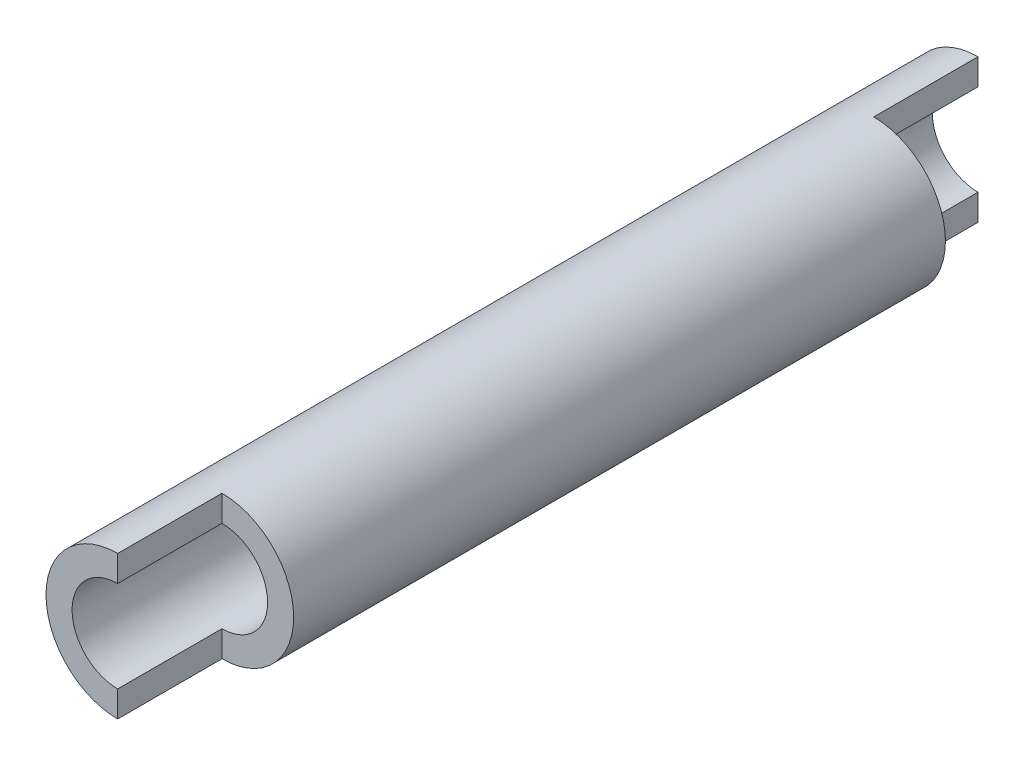
ISO-10303-21;
HEADER;
FILE_DESCRIPTION(('STEP AP214'),'2;1');
FILE_NAME('part.step','',(''),(''),'','','');
FILE_SCHEMA(('AUTOMOTIVE_DESIGN { 1 0 10303 214 1 1 1 1 }'));
ENDSEC;
DATA;
#1=APPLICATION_CONTEXT('core data for automotive mechanical design processes');
#2=APPLICATION_PROTOCOL_DEFINITION('international standard','automotive_design',2000,#1);
#3=PRODUCT_CONTEXT('',#1,'mechanical');
#4=PRODUCT('Part','Part','',(#3));
#5=PRODUCT_RELATED_PRODUCT_CATEGORY('part','',(#4));
#6=PRODUCT_DEFINITION_FORMATION('','',#4);
#7=PRODUCT_DEFINITION_CONTEXT('part definition',#1,'design');
#8=PRODUCT_DEFINITION('design','',#6,#7);
#9=PRODUCT_DEFINITION_SHAPE('','',#8);
#10=(LENGTH_UNIT() NAMED_UNIT(*) SI_UNIT(.MILLI.,.METRE.));
#11=(NAMED_UNIT(*) PLANE_ANGLE_UNIT() SI_UNIT($,.RADIAN.));
#12=(NAMED_UNIT(*) SI_UNIT($,.STERADIAN.) SOLID_ANGLE_UNIT());
#13=UNCERTAINTY_MEASURE_WITH_UNIT(LENGTH_MEASURE(1.E-05),#10,'distance_accuracy_value','');
#14=(GEOMETRIC_REPRESENTATION_CONTEXT(3) GLOBAL_UNCERTAINTY_ASSIGNED_CONTEXT((#13)) GLOBAL_UNIT_ASSIGNED_CONTEXT((#10,
#11,#12)) REPRESENTATION_CONTEXT('',''));
#15=CARTESIAN_POINT('',(0.,0.,0.));
#16=DIRECTION('',(0.,0.,1.));
#17=DIRECTION('',(1.,0.,0.));
#18=AXIS2_PLACEMENT_3D('',#15,#16,#17);
#19=CARTESIAN_POINT('',(0.,0.,50.));
#20=DIRECTION('',(0.,0.,1.));
#21=DIRECTION('',(1.,0.,0.));
#22=AXIS2_PLACEMENT_3D('',#19,#20,#21);
#23=PLANE('',#22);
#24=DIRECTION('',(0.,1.,0.));
#25=VECTOR('',#24,1.);
#26=CARTESIAN_POINT('',(0.,0.,50.));
#27=LINE('',#26,#25);
#28=CARTESIAN_POINT('',(0.,-5.5,50.));
#29=VERTEX_POINT('',#28);
#30=CARTESIAN_POINT('',(0.,-3.5,50.));
#31=VERTEX_POINT('',#30);
#32=EDGE_CURVE('E155',#29,#31,#27,.T.);
#33=ORIENTED_EDGE('',*,*,#32,.F.);
#34=CARTESIAN_POINT('',(0.,0.,50.));
#35=DIRECTION('',(0.,0.,1.));
#36=DIRECTION('',(1.,0.,0.));
#37=AXIS2_PLACEMENT_3D('',#34,#35,#36);
#38=CIRCLE('',#37,5.5);
#39=CARTESIAN_POINT('',(0.,5.5,50.));
#40=VERTEX_POINT('',#39);
#41=EDGE_CURVE('E12',#29,#40,#38,.T.);
#42=ORIENTED_EDGE('',*,*,#41,.T.);
#43=DIRECTION('',(0.,1.,0.));
#44=VECTOR('',#43,1.);
#45=CARTESIAN_POINT('',(0.,0.,50.));
#46=LINE('',#45,#44);
#47=CARTESIAN_POINT('',(0.,3.5,50.));
#48=VERTEX_POINT('',#47);
#49=EDGE_CURVE('E151',#48,#40,#46,.T.);
#50=ORIENTED_EDGE('',*,*,#49,.F.);
#51=CARTESIAN_POINT('',(0.,0.,50.));
#52=DIRECTION('',(0.,0.,1.));
#53=DIRECTION('',(1.,0.,0.));
#54=AXIS2_PLACEMENT_3D('',#51,#52,#53);
#55=CIRCLE('',#54,3.5);
#56=EDGE_CURVE('E158',#31,#48,#55,.T.);
#57=ORIENTED_EDGE('',*,*,#56,.F.);
#58=EDGE_LOOP('',(#33,#42,#50,#57));
#59=FACE_BOUND('',#58,.T.);
#60=ADVANCED_FACE('F37',(#59),#23,.T.);
#61=CARTESIAN_POINT('',(0.,0.,0.));
#62=DIRECTION('',(0.,0.,1.));
#63=DIRECTION('',(1.,0.,0.));
#64=AXIS2_PLACEMENT_3D('',#61,#62,#63);
#65=PLANE('',#64);
#66=CARTESIAN_POINT('',(0.,0.,0.));
#67=DIRECTION('',(0.,0.,1.));
#68=DIRECTION('',(1.,0.,0.));
#69=AXIS2_PLACEMENT_3D('',#66,#67,#68);
#70=CIRCLE('',#69,5.5);
#71=CARTESIAN_POINT('',(0.,-5.5,0.));
#72=VERTEX_POINT('',#71);
#73=CARTESIAN_POINT('',(0.,5.5,0.));
#74=VERTEX_POINT('',#73);
#75=EDGE_CURVE('E41',#72,#74,#70,.T.);
#76=ORIENTED_EDGE('',*,*,#75,.F.);
#77=DIRECTION('',(0.,1.,0.));
#78=VECTOR('',#77,1.);
#79=CARTESIAN_POINT('',(0.,0.,0.));
#80=LINE('',#79,#78);
#81=CARTESIAN_POINT('',(0.,-3.5,0.));
#82=VERTEX_POINT('',#81);
#83=EDGE_CURVE('E153',#72,#82,#80,.T.);
#84=ORIENTED_EDGE('',*,*,#83,.T.);
#85=CARTESIAN_POINT('',(0.,0.,0.));
#86=DIRECTION('',(0.,0.,1.));
#87=DIRECTION('',(1.,0.,0.));
#88=AXIS2_PLACEMENT_3D('',#85,#86,#87);
#89=CIRCLE('',#88,3.5);
#90=CARTESIAN_POINT('',(0.,3.5,0.));
#91=VERTEX_POINT('',#90);
#92=EDGE_CURVE('E107',#82,#91,#89,.T.);
#93=ORIENTED_EDGE('',*,*,#92,.T.);
#94=DIRECTION('',(0.,1.,0.));
#95=VECTOR('',#94,1.);
#96=CARTESIAN_POINT('',(0.,0.,0.));
#97=LINE('',#96,#95);
#98=EDGE_CURVE('E56',#91,#74,#97,.T.);
#99=ORIENTED_EDGE('',*,*,#98,.T.);
#100=EDGE_LOOP('',(#76,#84,#93,#99));
#101=FACE_BOUND('',#100,.T.);
#102=ADVANCED_FACE('F161',(#101),#65,.F.);
#103=CARTESIAN_POINT('',(0.,0.,50.));
#104=DIRECTION('',(0.,0.,-1.));
#105=DIRECTION('',(-1.,0.,0.));
#106=AXIS2_PLACEMENT_3D('',#103,#104,#105);
#107=CYLINDRICAL_SURFACE('',#106,5.5);
#108=ORIENTED_EDGE('',*,*,#75,.T.);
#109=DIRECTION('',(0.,0.,-1.));
#110=VECTOR('',#109,1.);
#111=CARTESIAN_POINT('',(0.,5.5,78.2983738762489));
#112=LINE('',#111,#110);
#113=CARTESIAN_POINT('',(0.,5.5,-8.));
#114=VERTEX_POINT('',#113);
#115=EDGE_CURVE('E144',#74,#114,#112,.T.);
#116=ORIENTED_EDGE('',*,*,#115,.T.);
#117=CARTESIAN_POINT('',(0.,0.,-8.));
#118=DIRECTION('',(0.,0.,-1.));
#119=DIRECTION('',(-1.,0.,0.));
#120=AXIS2_PLACEMENT_3D('',#117,#118,#119);
#121=CIRCLE('',#120,5.5);
#122=CARTESIAN_POINT('',(0.,-5.5,-8.));
#123=VERTEX_POINT('',#122);
#124=EDGE_CURVE('E120',#123,#114,#121,.T.);
#125=ORIENTED_EDGE('',*,*,#124,.F.);
#126=DIRECTION('',(0.,0.,-1.));
#127=VECTOR('',#126,1.);
#128=CARTESIAN_POINT('',(0.,-5.5,78.2983738762489));
#129=LINE('',#128,#127);
#130=EDGE_CURVE('E116',#72,#123,#129,.T.);
#131=ORIENTED_EDGE('',*,*,#130,.F.);
#132=EDGE_LOOP('',(#108,#116,#125,#131));
#133=FACE_BOUND('',#132,.T.);
#134=ORIENTED_EDGE('',*,*,#41,.F.);
#135=CARTESIAN_POINT('',(0.,-5.5,58.));
#136=VERTEX_POINT('',#135);
#137=EDGE_CURVE('E145',#136,#29,#129,.T.);
#138=ORIENTED_EDGE('',*,*,#137,.F.);
#139=CARTESIAN_POINT('',(0.,0.,58.));
#140=DIRECTION('',(0.,0.,1.));
#141=DIRECTION('',(1.,0.,0.));
#142=AXIS2_PLACEMENT_3D('',#139,#140,#141);
#143=CIRCLE('',#142,5.5);
#144=CARTESIAN_POINT('',(0.,5.5,58.));
#145=VERTEX_POINT('',#144);
#146=EDGE_CURVE('E141',#136,#145,#143,.F.);
#147=ORIENTED_EDGE('',*,*,#146,.T.);
#148=EDGE_CURVE('E140',#145,#40,#112,.T.);
#149=ORIENTED_EDGE('',*,*,#148,.T.);
#150=EDGE_LOOP('',(#134,#138,#147,#149));
#151=FACE_BOUND('',#150,.T.);
#152=ADVANCED_FACE('F39',(#133,#151),#107,.T.);
#153=CARTESIAN_POINT('',(0.,0.,50.));
#154=DIRECTION('',(0.,0.,-1.));
#155=DIRECTION('',(-1.,0.,0.));
#156=AXIS2_PLACEMENT_3D('',#153,#154,#155);
#157=CYLINDRICAL_SURFACE('',#156,3.5);
#158=ORIENTED_EDGE('',*,*,#92,.F.);
#159=DIRECTION('',(0.,0.,-1.));
#160=VECTOR('',#159,1.);
#161=CARTESIAN_POINT('',(0.,-3.5,78.2983738762489));
#162=LINE('',#161,#160);
#163=CARTESIAN_POINT('',(0.,-3.5,-8.));
#164=VERTEX_POINT('',#163);
#165=EDGE_CURVE('E100',#82,#164,#162,.T.);
#166=ORIENTED_EDGE('',*,*,#165,.T.);
#167=CARTESIAN_POINT('',(0.,0.,-8.));
#168=DIRECTION('',(0.,0.,1.));
#169=DIRECTION('',(-1.,0.,0.));
#170=AXIS2_PLACEMENT_3D('',#167,#168,#169);
#171=CIRCLE('',#170,3.5);
#172=CARTESIAN_POINT('',(0.,3.5,-8.));
#173=VERTEX_POINT('',#172);
#174=EDGE_CURVE('E106',#173,#164,#171,.T.);
#175=ORIENTED_EDGE('',*,*,#174,.F.);
#176=DIRECTION('',(0.,0.,-1.));
#177=VECTOR('',#176,1.);
#178=CARTESIAN_POINT('',(0.,3.5,78.2983738762489));
#179=LINE('',#178,#177);
#180=EDGE_CURVE('E139',#91,#173,#179,.T.);
#181=ORIENTED_EDGE('',*,*,#180,.F.);
#182=EDGE_LOOP('',(#158,#166,#175,#181));
#183=FACE_BOUND('',#182,.T.);
#184=ORIENTED_EDGE('',*,*,#56,.T.);
#185=CARTESIAN_POINT('',(0.,3.5,58.));
#186=VERTEX_POINT('',#185);
#187=EDGE_CURVE('E135',#186,#48,#179,.T.);
#188=ORIENTED_EDGE('',*,*,#187,.F.);
#189=CARTESIAN_POINT('',(0.,0.,58.));
#190=DIRECTION('',(0.,0.,1.));
#191=DIRECTION('',(1.,0.,0.));
#192=AXIS2_PLACEMENT_3D('',#189,#190,#191);
#193=CIRCLE('',#192,3.5);
#194=CARTESIAN_POINT('',(0.,-3.5,58.));
#195=VERTEX_POINT('',#194);
#196=EDGE_CURVE('E110',#186,#195,#193,.T.);
#197=ORIENTED_EDGE('',*,*,#196,.T.);
#198=EDGE_CURVE('E109',#195,#31,#162,.T.);
#199=ORIENTED_EDGE('',*,*,#198,.T.);
#200=EDGE_LOOP('',(#184,#188,#197,#199));
#201=FACE_BOUND('',#200,.T.);
#202=ADVANCED_FACE('F102',(#183,#201),#157,.F.);
#203=CARTESIAN_POINT('',(0.,0.,-8.));
#204=DIRECTION('',(0.,0.,-1.));
#205=DIRECTION('',(-1.,0.,0.));
#206=AXIS2_PLACEMENT_3D('',#203,#204,#205);
#207=PLANE('',#206);
#208=ORIENTED_EDGE('',*,*,#174,.T.);
#209=DIRECTION('',(0.,-1.,0.));
#210=VECTOR('',#209,1.);
#211=CARTESIAN_POINT('',(0.,-3.5,-8.));
#212=LINE('',#211,#210);
#213=EDGE_CURVE('E113',#164,#123,#212,.T.);
#214=ORIENTED_EDGE('',*,*,#213,.T.);
#215=ORIENTED_EDGE('',*,*,#124,.T.);
#216=DIRECTION('',(0.,-1.,0.));
#217=VECTOR('',#216,1.);
#218=CARTESIAN_POINT('',(0.,5.5,-8.));
#219=LINE('',#218,#217);
#220=EDGE_CURVE('E125',#114,#173,#219,.T.);
#221=ORIENTED_EDGE('',*,*,#220,.T.);
#222=EDGE_LOOP('',(#208,#214,#215,#221));
#223=FACE_BOUND('',#222,.T.);
#224=ADVANCED_FACE('F123',(#223),#207,.T.);
#225=CARTESIAN_POINT('',(0.,5.5,78.2983738762489));
#226=DIRECTION('',(1.,0.,0.));
#227=DIRECTION('',(0.,0.,-1.));
#228=AXIS2_PLACEMENT_3D('',#225,#226,#227);
#229=PLANE('',#228);
#230=ORIENTED_EDGE('',*,*,#98,.F.);
#231=ORIENTED_EDGE('',*,*,#180,.T.);
#232=ORIENTED_EDGE('',*,*,#220,.F.);
#233=ORIENTED_EDGE('',*,*,#115,.F.);
#234=EDGE_LOOP('',(#230,#231,#232,#233));
#235=FACE_BOUND('',#234,.T.);
#236=ADVANCED_FACE('F164',(#235),#229,.T.);
#237=CARTESIAN_POINT('',(0.,-3.5,78.2983738762489));
#238=DIRECTION('',(1.,0.,0.));
#239=DIRECTION('',(0.,0.,-1.));
#240=AXIS2_PLACEMENT_3D('',#237,#238,#239);
#241=PLANE('',#240);
#242=ORIENTED_EDGE('',*,*,#83,.F.);
#243=ORIENTED_EDGE('',*,*,#130,.T.);
#244=ORIENTED_EDGE('',*,*,#213,.F.);
#245=ORIENTED_EDGE('',*,*,#165,.F.);
#246=EDGE_LOOP('',(#242,#243,#244,#245));
#247=FACE_BOUND('',#246,.T.);
#248=ADVANCED_FACE('F114',(#247),#241,.T.);
#249=CARTESIAN_POINT('',(0.,0.,58.));
#250=DIRECTION('',(0.,0.,1.));
#251=DIRECTION('',(1.,0.,0.));
#252=AXIS2_PLACEMENT_3D('',#249,#250,#251);
#253=PLANE('',#252);
#254=ORIENTED_EDGE('',*,*,#196,.F.);
#255=DIRECTION('',(0.,-1.,0.));
#256=VECTOR('',#255,1.);
#257=CARTESIAN_POINT('',(0.,5.5,58.));
#258=LINE('',#257,#256);
#259=EDGE_CURVE('E136',#145,#186,#258,.T.);
#260=ORIENTED_EDGE('',*,*,#259,.F.);
#261=ORIENTED_EDGE('',*,*,#146,.F.);
#262=DIRECTION('',(0.,-1.,0.));
#263=VECTOR('',#262,1.);
#264=CARTESIAN_POINT('',(0.,-3.5,58.));
#265=LINE('',#264,#263);
#266=EDGE_CURVE('E130',#195,#136,#265,.T.);
#267=ORIENTED_EDGE('',*,*,#266,.F.);
#268=EDGE_LOOP('',(#254,#260,#261,#267));
#269=FACE_BOUND('',#268,.T.);
#270=ADVANCED_FACE('F179',(#269),#253,.T.);
#271=ORIENTED_EDGE('',*,*,#137,.T.);
#272=ORIENTED_EDGE('',*,*,#32,.T.);
#273=ORIENTED_EDGE('',*,*,#198,.F.);
#274=ORIENTED_EDGE('',*,*,#266,.T.);
#275=EDGE_LOOP('',(#271,#272,#273,#274));
#276=FACE_BOUND('',#275,.T.);
#277=ADVANCED_FACE('F177',(#276),#241,.T.);
#278=ORIENTED_EDGE('',*,*,#187,.T.);
#279=ORIENTED_EDGE('',*,*,#49,.T.);
#280=ORIENTED_EDGE('',*,*,#148,.F.);
#281=ORIENTED_EDGE('',*,*,#259,.T.);
#282=EDGE_LOOP('',(#278,#279,#280,#281));
#283=FACE_BOUND('',#282,.T.);
#284=ADVANCED_FACE('F182',(#283),#229,.T.);
#285=CLOSED_SHELL('',(#60,#102,#152,#202,#224,#236,#248,#270,#277,#284));
#286=MANIFOLD_SOLID_BREP('B2',#285);
#287=ADVANCED_BREP_SHAPE_REPRESENTATION('',(#18,#286),#14);
#288=SHAPE_DEFINITION_REPRESENTATION(#9,#287);
ENDSEC;
END-ISO-10303-21;
